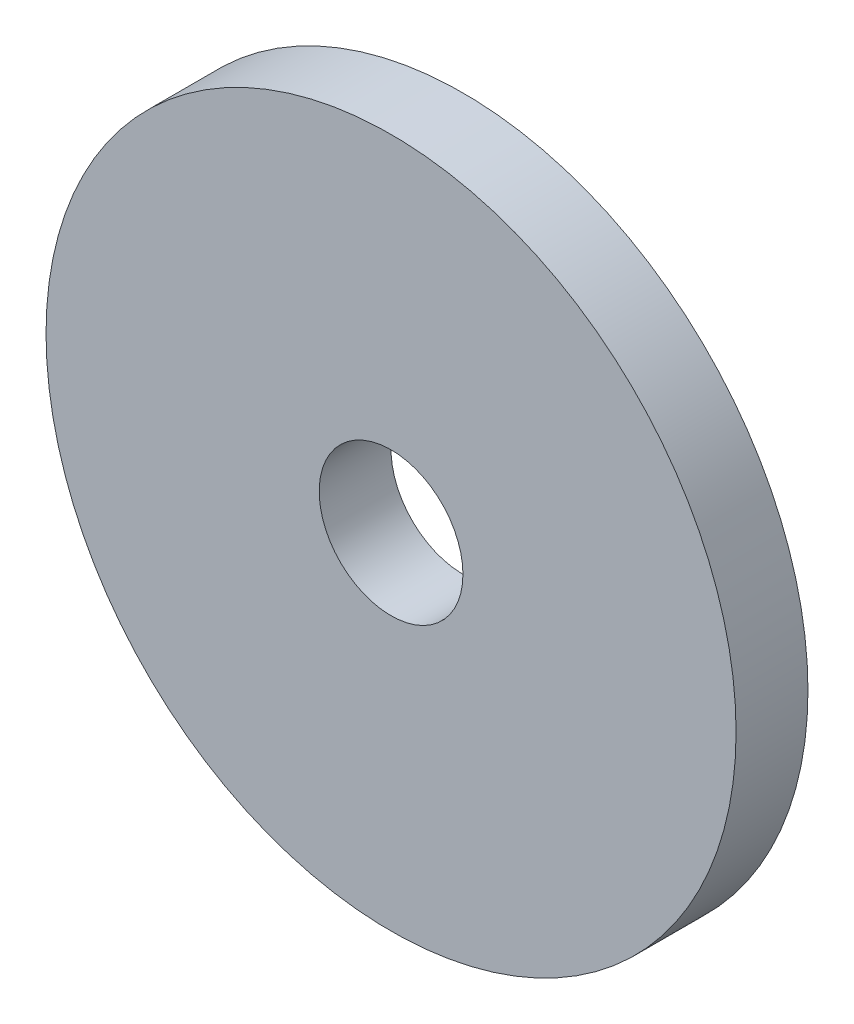
ISO-10303-21;
HEADER;
FILE_DESCRIPTION(('STEP AP214'),'2;1');
FILE_NAME('part.step','',(''),(''),'','','');
FILE_SCHEMA(('AUTOMOTIVE_DESIGN { 1 0 10303 214 1 1 1 1 }'));
ENDSEC;
DATA;
#1=APPLICATION_CONTEXT('core data for automotive mechanical design processes');
#2=APPLICATION_PROTOCOL_DEFINITION('international standard','automotive_design',2000,#1);
#3=PRODUCT_CONTEXT('',#1,'mechanical');
#4=PRODUCT('Part','Part','',(#3));
#5=PRODUCT_RELATED_PRODUCT_CATEGORY('part','',(#4));
#6=PRODUCT_DEFINITION_FORMATION('','',#4);
#7=PRODUCT_DEFINITION_CONTEXT('part definition',#1,'design');
#8=PRODUCT_DEFINITION('design','',#6,#7);
#9=PRODUCT_DEFINITION_SHAPE('','',#8);
#10=(LENGTH_UNIT() NAMED_UNIT(*) SI_UNIT(.MILLI.,.METRE.));
#11=(NAMED_UNIT(*) PLANE_ANGLE_UNIT() SI_UNIT($,.RADIAN.));
#12=(NAMED_UNIT(*) SI_UNIT($,.STERADIAN.) SOLID_ANGLE_UNIT());
#13=UNCERTAINTY_MEASURE_WITH_UNIT(LENGTH_MEASURE(1.E-05),#10,'distance_accuracy_value','');
#14=(GEOMETRIC_REPRESENTATION_CONTEXT(3) GLOBAL_UNCERTAINTY_ASSIGNED_CONTEXT((#13)) GLOBAL_UNIT_ASSIGNED_CONTEXT((#10,
#11,#12)) REPRESENTATION_CONTEXT('',''));
#15=CARTESIAN_POINT('',(0.,0.,0.));
#16=DIRECTION('',(0.,0.,1.));
#17=DIRECTION('',(1.,0.,0.));
#18=AXIS2_PLACEMENT_3D('',#15,#16,#17);
#19=CARTESIAN_POINT('',(0.,0.,10.));
#20=DIRECTION('',(0.,0.,-1.));
#21=DIRECTION('',(-1.,0.,0.));
#22=AXIS2_PLACEMENT_3D('',#19,#20,#21);
#23=CYLINDRICAL_SURFACE('',#22,48.);
#24=CARTESIAN_POINT('',(0.,0.,10.));
#25=DIRECTION('',(0.,0.,1.));
#26=DIRECTION('',(1.,0.,0.));
#27=AXIS2_PLACEMENT_3D('',#24,#25,#26);
#28=CIRCLE('',#27,48.);
#29=CARTESIAN_POINT('',(48.,0.,10.));
#30=VERTEX_POINT('',#29);
#31=EDGE_CURVE('E10',#30,#30,#28,.T.);
#32=ORIENTED_EDGE('',*,*,#31,.F.);
#33=EDGE_LOOP('',(#32));
#34=FACE_BOUND('',#33,.T.);
#35=CARTESIAN_POINT('',(0.,0.,0.));
#36=DIRECTION('',(0.,0.,1.));
#37=DIRECTION('',(1.,0.,0.));
#38=AXIS2_PLACEMENT_3D('',#35,#36,#37);
#39=CIRCLE('',#38,48.);
#40=CARTESIAN_POINT('',(48.,0.,0.));
#41=VERTEX_POINT('',#40);
#42=EDGE_CURVE('E36',#41,#41,#39,.T.);
#43=ORIENTED_EDGE('',*,*,#42,.T.);
#44=EDGE_LOOP('',(#43));
#45=FACE_BOUND('',#44,.T.);
#46=ADVANCED_FACE('F33',(#34,#45),#23,.T.);
#47=CARTESIAN_POINT('',(0.,0.,10.));
#48=DIRECTION('',(0.,0.,1.));
#49=DIRECTION('',(1.,0.,0.));
#50=AXIS2_PLACEMENT_3D('',#47,#48,#49);
#51=PLANE('',#50);
#52=CARTESIAN_POINT('',(0.,0.,10.));
#53=DIRECTION('',(0.,0.,1.));
#54=DIRECTION('',(1.,0.,0.));
#55=AXIS2_PLACEMENT_3D('',#52,#53,#54);
#56=CIRCLE('',#55,10.);
#57=CARTESIAN_POINT('',(10.,0.,10.));
#58=VERTEX_POINT('',#57);
#59=EDGE_CURVE('E45',#58,#58,#56,.T.);
#60=ORIENTED_EDGE('',*,*,#59,.F.);
#61=EDGE_LOOP('',(#60));
#62=FACE_BOUND('',#61,.T.);
#63=ORIENTED_EDGE('',*,*,#31,.T.);
#64=EDGE_LOOP('',(#63));
#65=FACE_BOUND('',#64,.T.);
#66=ADVANCED_FACE('F60',(#62,#65),#51,.T.);
#67=CARTESIAN_POINT('',(0.,0.,0.));
#68=DIRECTION('',(0.,0.,1.));
#69=DIRECTION('',(1.,0.,0.));
#70=AXIS2_PLACEMENT_3D('',#67,#68,#69);
#71=PLANE('',#70);
#72=CARTESIAN_POINT('',(0.,0.,0.));
#73=DIRECTION('',(0.,0.,1.));
#74=DIRECTION('',(1.,0.,0.));
#75=AXIS2_PLACEMENT_3D('',#72,#73,#74);
#76=CIRCLE('',#75,10.);
#77=CARTESIAN_POINT('',(10.,0.,0.));
#78=VERTEX_POINT('',#77);
#79=EDGE_CURVE('E43',#78,#78,#76,.T.);
#80=ORIENTED_EDGE('',*,*,#79,.T.);
#81=EDGE_LOOP('',(#80));
#82=FACE_BOUND('',#81,.T.);
#83=ORIENTED_EDGE('',*,*,#42,.F.);
#84=EDGE_LOOP('',(#83));
#85=FACE_BOUND('',#84,.T.);
#86=ADVANCED_FACE('F51',(#82,#85),#71,.F.);
#87=CARTESIAN_POINT('',(0.,0.,0.));
#88=DIRECTION('',(0.,0.,1.));
#89=DIRECTION('',(1.,0.,0.));
#90=AXIS2_PLACEMENT_3D('',#87,#88,#89);
#91=CYLINDRICAL_SURFACE('',#90,10.);
#92=ORIENTED_EDGE('',*,*,#79,.F.);
#93=EDGE_LOOP('',(#92));
#94=FACE_BOUND('',#93,.T.);
#95=ORIENTED_EDGE('',*,*,#59,.T.);
#96=EDGE_LOOP('',(#95));
#97=FACE_BOUND('',#96,.T.);
#98=ADVANCED_FACE('F54',(#94,#97),#91,.F.);
#99=CLOSED_SHELL('',(#46,#66,#86,#98));
#100=MANIFOLD_SOLID_BREP('B2',#99);
#101=ADVANCED_BREP_SHAPE_REPRESENTATION('',(#18,#100),#14);
#102=SHAPE_DEFINITION_REPRESENTATION(#9,#101);
ENDSEC;
END-ISO-10303-21;
